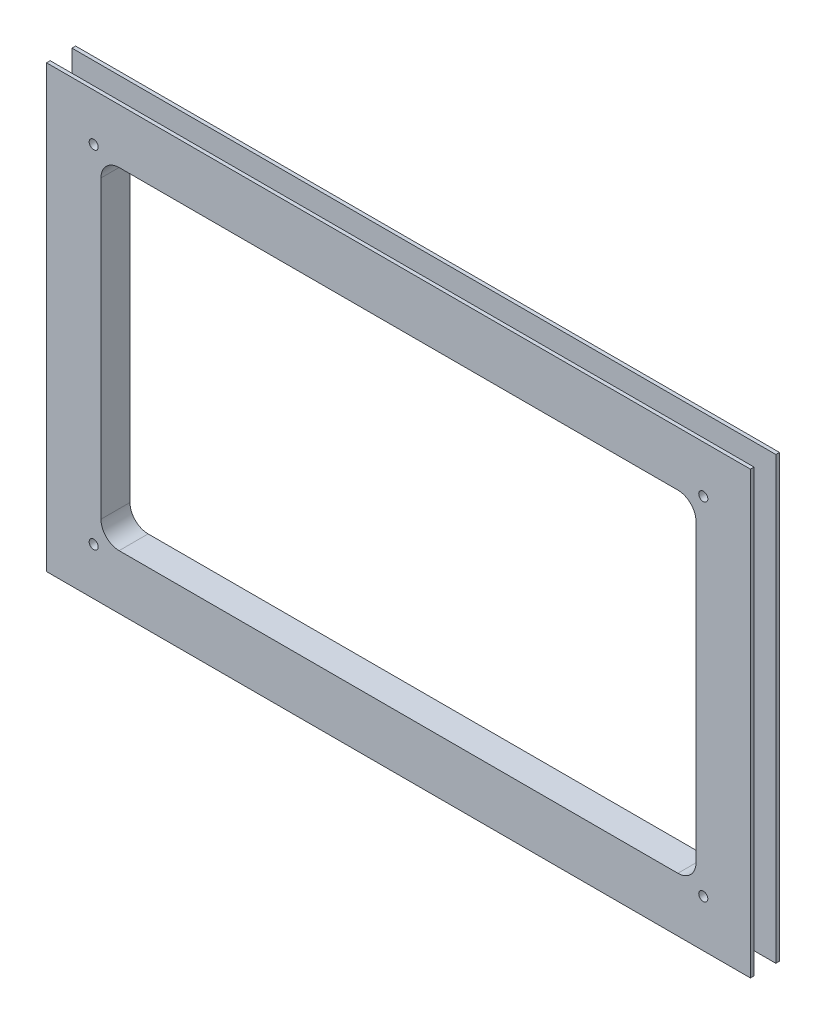
ISO-10303-21;
HEADER;
FILE_DESCRIPTION(('STEP AP214'),'2;1');
FILE_NAME('part.step','',(''),(''),'','','');
FILE_SCHEMA(('AUTOMOTIVE_DESIGN { 1 0 10303 214 1 1 1 1 }'));
ENDSEC;
DATA;
#1=APPLICATION_CONTEXT('core data for automotive mechanical design processes');
#2=APPLICATION_PROTOCOL_DEFINITION('international standard','automotive_design',2000,#1);
#3=PRODUCT_CONTEXT('',#1,'mechanical');
#4=PRODUCT('Part','Part','',(#3));
#5=PRODUCT_RELATED_PRODUCT_CATEGORY('part','',(#4));
#6=PRODUCT_DEFINITION_FORMATION('','',#4);
#7=PRODUCT_DEFINITION_CONTEXT('part definition',#1,'design');
#8=PRODUCT_DEFINITION('design','',#6,#7);
#9=PRODUCT_DEFINITION_SHAPE('','',#8);
#10=(LENGTH_UNIT() NAMED_UNIT(*) SI_UNIT(.MILLI.,.METRE.));
#11=(NAMED_UNIT(*) PLANE_ANGLE_UNIT() SI_UNIT($,.RADIAN.));
#12=(NAMED_UNIT(*) SI_UNIT($,.STERADIAN.) SOLID_ANGLE_UNIT());
#13=UNCERTAINTY_MEASURE_WITH_UNIT(LENGTH_MEASURE(1.E-05),#10,'distance_accuracy_value','');
#14=(GEOMETRIC_REPRESENTATION_CONTEXT(3) GLOBAL_UNCERTAINTY_ASSIGNED_CONTEXT((#13)) GLOBAL_UNIT_ASSIGNED_CONTEXT((#10,
#11,#12)) REPRESENTATION_CONTEXT('',''));
#15=CARTESIAN_POINT('',(0.,0.,0.));
#16=DIRECTION('',(0.,0.,1.));
#17=DIRECTION('',(1.,0.,0.));
#18=AXIS2_PLACEMENT_3D('',#15,#16,#17);
#19=CARTESIAN_POINT('',(0.,0.,-6.));
#20=DIRECTION('',(0.,0.,1.));
#21=DIRECTION('',(1.,0.,0.));
#22=AXIS2_PLACEMENT_3D('',#19,#20,#21);
#23=PLANE('',#22);
#24=DIRECTION('',(0.,1.,0.));
#25=VECTOR('',#24,1.);
#26=CARTESIAN_POINT('',(-194.,-121.45,-6.));
#27=LINE('',#26,#25);
#28=CARTESIAN_POINT('',(-194.,121.45,-6.));
#29=VERTEX_POINT('',#28);
#30=CARTESIAN_POINT('',(-194.,-121.45,-6.));
#31=VERTEX_POINT('',#30);
#32=EDGE_CURVE('E273',#29,#31,#27,.F.);
#33=ORIENTED_EDGE('',*,*,#32,.T.);
#34=DIRECTION('',(1.,0.,0.));
#35=VECTOR('',#34,1.);
#36=CARTESIAN_POINT('',(-194.,-121.45,-6.));
#37=LINE('',#36,#35);
#38=CARTESIAN_POINT('',(194.,-121.45,-6.));
#39=VERTEX_POINT('',#38);
#40=EDGE_CURVE('E267',#31,#39,#37,.T.);
#41=ORIENTED_EDGE('',*,*,#40,.T.);
#42=DIRECTION('',(0.,1.,0.));
#43=VECTOR('',#42,1.);
#44=CARTESIAN_POINT('',(194.,-121.45,-6.));
#45=LINE('',#44,#43);
#46=CARTESIAN_POINT('',(194.,121.45,-6.));
#47=VERTEX_POINT('',#46);
#48=EDGE_CURVE('E261',#39,#47,#45,.T.);
#49=ORIENTED_EDGE('',*,*,#48,.T.);
#50=DIRECTION('',(1.,0.,0.));
#51=VECTOR('',#50,1.);
#52=CARTESIAN_POINT('',(-194.,121.45,-6.));
#53=LINE('',#52,#51);
#54=EDGE_CURVE('E242',#47,#29,#53,.F.);
#55=ORIENTED_EDGE('',*,*,#54,.T.);
#56=EDGE_LOOP('',(#33,#41,#49,#55));
#57=FACE_BOUND('',#56,.T.);
#58=DIRECTION('',(0.,1.,0.));
#59=VECTOR('',#58,1.);
#60=CARTESIAN_POINT('',(-181.,-108.45,-6.));
#61=LINE('',#60,#59);
#62=CARTESIAN_POINT('',(-181.,98.45,-6.));
#63=VERTEX_POINT('',#62);
#64=CARTESIAN_POINT('',(-181.,-98.45,-6.));
#65=VERTEX_POINT('',#64);
#66=EDGE_CURVE('E163',#63,#65,#61,.F.);
#67=ORIENTED_EDGE('',*,*,#66,.F.);
#68=CARTESIAN_POINT('',(-171.,98.45,-6.));
#69=DIRECTION('',(0.,0.,1.));
#70=DIRECTION('',(1.,0.,0.));
#71=AXIS2_PLACEMENT_3D('',#68,#69,#70);
#72=CIRCLE('',#71,10.);
#73=CARTESIAN_POINT('',(-171.,108.45,-6.));
#74=VERTEX_POINT('',#73);
#75=EDGE_CURVE('E243',#74,#63,#72,.T.);
#76=ORIENTED_EDGE('',*,*,#75,.F.);
#77=DIRECTION('',(1.,0.,0.));
#78=VECTOR('',#77,1.);
#79=CARTESIAN_POINT('',(181.,108.45,-6.));
#80=LINE('',#79,#78);
#81=CARTESIAN_POINT('',(171.,108.45,-6.));
#82=VERTEX_POINT('',#81);
#83=EDGE_CURVE('E148',#82,#74,#80,.F.);
#84=ORIENTED_EDGE('',*,*,#83,.F.);
#85=CARTESIAN_POINT('',(171.,98.45,-6.));
#86=DIRECTION('',(0.,0.,1.));
#87=DIRECTION('',(1.,0.,0.));
#88=AXIS2_PLACEMENT_3D('',#85,#86,#87);
#89=CIRCLE('',#88,10.);
#90=CARTESIAN_POINT('',(181.,98.45,-6.));
#91=VERTEX_POINT('',#90);
#92=EDGE_CURVE('E19',#91,#82,#89,.T.);
#93=ORIENTED_EDGE('',*,*,#92,.F.);
#94=DIRECTION('',(0.,1.,0.));
#95=VECTOR('',#94,1.);
#96=CARTESIAN_POINT('',(181.,-108.45,-6.));
#97=LINE('',#96,#95);
#98=CARTESIAN_POINT('',(181.,-98.45,-6.));
#99=VERTEX_POINT('',#98);
#100=EDGE_CURVE('E133',#99,#91,#97,.T.);
#101=ORIENTED_EDGE('',*,*,#100,.F.);
#102=CARTESIAN_POINT('',(171.,-98.45,-6.));
#103=DIRECTION('',(0.,0.,1.));
#104=DIRECTION('',(1.,0.,0.));
#105=AXIS2_PLACEMENT_3D('',#102,#103,#104);
#106=CIRCLE('',#105,10.);
#107=CARTESIAN_POINT('',(171.,-108.45,-6.));
#108=VERTEX_POINT('',#107);
#109=EDGE_CURVE('E155',#108,#99,#106,.T.);
#110=ORIENTED_EDGE('',*,*,#109,.F.);
#111=DIRECTION('',(1.,0.,0.));
#112=VECTOR('',#111,1.);
#113=CARTESIAN_POINT('',(181.,-108.45,-6.));
#114=LINE('',#113,#112);
#115=CARTESIAN_POINT('',(-171.,-108.45,-6.));
#116=VERTEX_POINT('',#115);
#117=EDGE_CURVE('E167',#116,#108,#114,.T.);
#118=ORIENTED_EDGE('',*,*,#117,.F.);
#119=CARTESIAN_POINT('',(-171.,-98.45,-6.));
#120=DIRECTION('',(0.,0.,1.));
#121=DIRECTION('',(1.,0.,0.));
#122=AXIS2_PLACEMENT_3D('',#119,#120,#121);
#123=CIRCLE('',#122,10.);
#124=EDGE_CURVE('E246',#65,#116,#123,.T.);
#125=ORIENTED_EDGE('',*,*,#124,.F.);
#126=EDGE_LOOP('',(#67,#76,#84,#93,#101,#110,#118,#125));
#127=FACE_BOUND('',#126,.T.);
#128=ADVANCED_FACE('F16',(#57,#127),#23,.T.);
#129=CARTESIAN_POINT('',(171.,98.45,-6.));
#130=DIRECTION('',(0.,0.,1.));
#131=DIRECTION('',(1.,0.,0.));
#132=AXIS2_PLACEMENT_3D('',#129,#130,#131);
#133=CYLINDRICAL_SURFACE('',#132,10.);
#134=CARTESIAN_POINT('',(171.,98.45,6.));
#135=DIRECTION('',(0.,0.,1.));
#136=DIRECTION('',(1.,0.,0.));
#137=AXIS2_PLACEMENT_3D('',#134,#135,#136);
#138=CIRCLE('',#137,10.);
#139=CARTESIAN_POINT('',(171.,108.45,6.));
#140=VERTEX_POINT('',#139);
#141=CARTESIAN_POINT('',(181.,98.45,6.));
#142=VERTEX_POINT('',#141);
#143=EDGE_CURVE('E154',#140,#142,#138,.F.);
#144=ORIENTED_EDGE('',*,*,#143,.T.);
#145=DIRECTION('',(0.,0.,-1.));
#146=VECTOR('',#145,1.);
#147=CARTESIAN_POINT('',(181.,98.45,-6.));
#148=LINE('',#147,#146);
#149=EDGE_CURVE('E138',#91,#142,#148,.F.);
#150=ORIENTED_EDGE('',*,*,#149,.F.);
#151=ORIENTED_EDGE('',*,*,#92,.T.);
#152=DIRECTION('',(0.,0.,1.));
#153=VECTOR('',#152,1.);
#154=CARTESIAN_POINT('',(171.,108.45,-6.));
#155=LINE('',#154,#153);
#156=EDGE_CURVE('E162',#140,#82,#155,.F.);
#157=ORIENTED_EDGE('',*,*,#156,.F.);
#158=EDGE_LOOP('',(#144,#150,#151,#157));
#159=FACE_BOUND('',#158,.T.);
#160=ADVANCED_FACE('F153',(#159),#133,.T.);
#161=CARTESIAN_POINT('',(181.,-108.45,-6.));
#162=DIRECTION('',(1.,0.,0.));
#163=DIRECTION('',(0.,0.,-1.));
#164=AXIS2_PLACEMENT_3D('',#161,#162,#163);
#165=PLANE('',#164);
#166=ORIENTED_EDGE('',*,*,#100,.T.);
#167=ORIENTED_EDGE('',*,*,#149,.T.);
#168=DIRECTION('',(0.,1.,0.));
#169=VECTOR('',#168,1.);
#170=CARTESIAN_POINT('',(181.,0.,6.));
#171=LINE('',#170,#169);
#172=CARTESIAN_POINT('',(181.,-98.45,6.));
#173=VERTEX_POINT('',#172);
#174=EDGE_CURVE('E240',#142,#173,#171,.F.);
#175=ORIENTED_EDGE('',*,*,#174,.T.);
#176=DIRECTION('',(0.,0.,1.));
#177=VECTOR('',#176,1.);
#178=CARTESIAN_POINT('',(181.,-98.45,-6.));
#179=LINE('',#178,#177);
#180=EDGE_CURVE('E140',#99,#173,#179,.T.);
#181=ORIENTED_EDGE('',*,*,#180,.F.);
#182=EDGE_LOOP('',(#166,#167,#175,#181));
#183=FACE_BOUND('',#182,.T.);
#184=ADVANCED_FACE('F135',(#183),#165,.T.);
#185=CARTESIAN_POINT('',(171.,-98.45,-6.));
#186=DIRECTION('',(0.,0.,1.));
#187=DIRECTION('',(1.,0.,0.));
#188=AXIS2_PLACEMENT_3D('',#185,#186,#187);
#189=CYLINDRICAL_SURFACE('',#188,10.);
#190=CARTESIAN_POINT('',(171.,-98.45,6.));
#191=DIRECTION('',(0.,0.,1.));
#192=DIRECTION('',(1.,0.,0.));
#193=AXIS2_PLACEMENT_3D('',#190,#191,#192);
#194=CIRCLE('',#193,10.);
#195=CARTESIAN_POINT('',(171.,-108.45,6.));
#196=VERTEX_POINT('',#195);
#197=EDGE_CURVE('E237',#173,#196,#194,.F.);
#198=ORIENTED_EDGE('',*,*,#197,.T.);
#199=DIRECTION('',(0.,0.,-1.));
#200=VECTOR('',#199,1.);
#201=CARTESIAN_POINT('',(171.,-108.45,-6.));
#202=LINE('',#201,#200);
#203=EDGE_CURVE('E168',#108,#196,#202,.F.);
#204=ORIENTED_EDGE('',*,*,#203,.F.);
#205=ORIENTED_EDGE('',*,*,#109,.T.);
#206=ORIENTED_EDGE('',*,*,#180,.T.);
#207=EDGE_LOOP('',(#198,#204,#205,#206));
#208=FACE_BOUND('',#207,.T.);
#209=ADVANCED_FACE('F513',(#208),#189,.T.);
#210=CARTESIAN_POINT('',(181.,-108.45,-6.));
#211=DIRECTION('',(0.,-1.,0.));
#212=DIRECTION('',(0.,0.,-1.));
#213=AXIS2_PLACEMENT_3D('',#210,#211,#212);
#214=PLANE('',#213);
#215=DIRECTION('',(1.,0.,0.));
#216=VECTOR('',#215,1.);
#217=CARTESIAN_POINT('',(0.,-108.45,6.));
#218=LINE('',#217,#216);
#219=CARTESIAN_POINT('',(-171.,-108.45,6.));
#220=VERTEX_POINT('',#219);
#221=EDGE_CURVE('E236',#196,#220,#218,.F.);
#222=ORIENTED_EDGE('',*,*,#221,.T.);
#223=DIRECTION('',(0.,0.,1.));
#224=VECTOR('',#223,1.);
#225=CARTESIAN_POINT('',(-171.,-108.45,-6.));
#226=LINE('',#225,#224);
#227=EDGE_CURVE('E166',#116,#220,#226,.T.);
#228=ORIENTED_EDGE('',*,*,#227,.F.);
#229=ORIENTED_EDGE('',*,*,#117,.T.);
#230=ORIENTED_EDGE('',*,*,#203,.T.);
#231=EDGE_LOOP('',(#222,#228,#229,#230));
#232=FACE_BOUND('',#231,.T.);
#233=ADVANCED_FACE('F518',(#232),#214,.T.);
#234=CARTESIAN_POINT('',(-171.,-98.45,-6.));
#235=DIRECTION('',(0.,0.,1.));
#236=DIRECTION('',(1.,0.,0.));
#237=AXIS2_PLACEMENT_3D('',#234,#235,#236);
#238=CYLINDRICAL_SURFACE('',#237,10.);
#239=CARTESIAN_POINT('',(-171.,-98.45,6.));
#240=DIRECTION('',(0.,0.,1.));
#241=DIRECTION('',(1.,0.,0.));
#242=AXIS2_PLACEMENT_3D('',#239,#240,#241);
#243=CIRCLE('',#242,10.);
#244=CARTESIAN_POINT('',(-181.,-98.45,6.));
#245=VERTEX_POINT('',#244);
#246=EDGE_CURVE('E233',#220,#245,#243,.F.);
#247=ORIENTED_EDGE('',*,*,#246,.T.);
#248=DIRECTION('',(0.,0.,1.));
#249=VECTOR('',#248,1.);
#250=CARTESIAN_POINT('',(-181.,-98.45,-6.));
#251=LINE('',#250,#249);
#252=EDGE_CURVE('E165',#65,#245,#251,.T.);
#253=ORIENTED_EDGE('',*,*,#252,.F.);
#254=ORIENTED_EDGE('',*,*,#124,.T.);
#255=ORIENTED_EDGE('',*,*,#227,.T.);
#256=EDGE_LOOP('',(#247,#253,#254,#255));
#257=FACE_BOUND('',#256,.T.);
#258=ADVANCED_FACE('F522',(#257),#238,.T.);
#259=CARTESIAN_POINT('',(-181.,-108.45,-6.));
#260=DIRECTION('',(-1.,0.,0.));
#261=DIRECTION('',(0.,0.,1.));
#262=AXIS2_PLACEMENT_3D('',#259,#260,#261);
#263=PLANE('',#262);
#264=DIRECTION('',(0.,1.,0.));
#265=VECTOR('',#264,1.);
#266=CARTESIAN_POINT('',(-181.,0.,6.));
#267=LINE('',#266,#265);
#268=CARTESIAN_POINT('',(-181.,98.45,6.));
#269=VERTEX_POINT('',#268);
#270=EDGE_CURVE('E232',#245,#269,#267,.T.);
#271=ORIENTED_EDGE('',*,*,#270,.T.);
#272=DIRECTION('',(0.,0.,1.));
#273=VECTOR('',#272,1.);
#274=CARTESIAN_POINT('',(-181.,98.45,-6.));
#275=LINE('',#274,#273);
#276=EDGE_CURVE('E245',#63,#269,#275,.T.);
#277=ORIENTED_EDGE('',*,*,#276,.F.);
#278=ORIENTED_EDGE('',*,*,#66,.T.);
#279=ORIENTED_EDGE('',*,*,#252,.T.);
#280=EDGE_LOOP('',(#271,#277,#278,#279));
#281=FACE_BOUND('',#280,.T.);
#282=ADVANCED_FACE('F525',(#281),#263,.T.);
#283=CARTESIAN_POINT('',(-171.,98.45,-6.));
#284=DIRECTION('',(0.,0.,1.));
#285=DIRECTION('',(1.,0.,0.));
#286=AXIS2_PLACEMENT_3D('',#283,#284,#285);
#287=CYLINDRICAL_SURFACE('',#286,10.);
#288=CARTESIAN_POINT('',(-171.,98.45,6.));
#289=DIRECTION('',(0.,0.,1.));
#290=DIRECTION('',(1.,0.,0.));
#291=AXIS2_PLACEMENT_3D('',#288,#289,#290);
#292=CIRCLE('',#291,10.);
#293=CARTESIAN_POINT('',(-171.,108.45,6.));
#294=VERTEX_POINT('',#293);
#295=EDGE_CURVE('E228',#269,#294,#292,.F.);
#296=ORIENTED_EDGE('',*,*,#295,.T.);
#297=DIRECTION('',(0.,0.,1.));
#298=VECTOR('',#297,1.);
#299=CARTESIAN_POINT('',(-171.,108.45,-6.));
#300=LINE('',#299,#298);
#301=EDGE_CURVE('E161',#74,#294,#300,.T.);
#302=ORIENTED_EDGE('',*,*,#301,.F.);
#303=ORIENTED_EDGE('',*,*,#75,.T.);
#304=ORIENTED_EDGE('',*,*,#276,.T.);
#305=EDGE_LOOP('',(#296,#302,#303,#304));
#306=FACE_BOUND('',#305,.T.);
#307=ADVANCED_FACE('F528',(#306),#287,.T.);
#308=CARTESIAN_POINT('',(181.,108.45,-6.));
#309=DIRECTION('',(0.,1.,0.));
#310=DIRECTION('',(0.,0.,1.));
#311=AXIS2_PLACEMENT_3D('',#308,#309,#310);
#312=PLANE('',#311);
#313=ORIENTED_EDGE('',*,*,#83,.T.);
#314=ORIENTED_EDGE('',*,*,#301,.T.);
#315=DIRECTION('',(1.,0.,0.));
#316=VECTOR('',#315,1.);
#317=CARTESIAN_POINT('',(0.,108.45,6.));
#318=LINE('',#317,#316);
#319=EDGE_CURVE('E231',#294,#140,#318,.T.);
#320=ORIENTED_EDGE('',*,*,#319,.T.);
#321=ORIENTED_EDGE('',*,*,#156,.T.);
#322=EDGE_LOOP('',(#313,#314,#320,#321));
#323=FACE_BOUND('',#322,.T.);
#324=ADVANCED_FACE('F532',(#323),#312,.T.);
#325=CARTESIAN_POINT('',(194.,-121.45,8.));
#326=DIRECTION('',(-1.,0.,0.));
#327=DIRECTION('',(0.,0.,1.));
#328=AXIS2_PLACEMENT_3D('',#325,#326,#327);
#329=PLANE('',#328);
#330=DIRECTION('',(0.,0.,1.));
#331=VECTOR('',#330,1.);
#332=CARTESIAN_POINT('',(194.,-121.45,8.));
#333=LINE('',#332,#331);
#334=CARTESIAN_POINT('',(194.,-121.45,-8.));
#335=VERTEX_POINT('',#334);
#336=EDGE_CURVE('E264',#39,#335,#333,.F.);
#337=ORIENTED_EDGE('',*,*,#336,.T.);
#338=DIRECTION('',(0.,1.,0.));
#339=VECTOR('',#338,1.);
#340=CARTESIAN_POINT('',(194.,0.,-8.));
#341=LINE('',#340,#339);
#342=CARTESIAN_POINT('',(194.,121.45,-8.));
#343=VERTEX_POINT('',#342);
#344=EDGE_CURVE('E290',#343,#335,#341,.F.);
#345=ORIENTED_EDGE('',*,*,#344,.F.);
#346=DIRECTION('',(0.,0.,-1.));
#347=VECTOR('',#346,1.);
#348=CARTESIAN_POINT('',(194.,121.45,8.));
#349=LINE('',#348,#347);
#350=EDGE_CURVE('E279',#343,#47,#349,.F.);
#351=ORIENTED_EDGE('',*,*,#350,.T.);
#352=ORIENTED_EDGE('',*,*,#48,.F.);
#353=EDGE_LOOP('',(#337,#345,#351,#352));
#354=FACE_BOUND('',#353,.T.);
#355=ADVANCED_FACE('F494',(#354),#329,.F.);
#356=CARTESIAN_POINT('',(-194.,-121.45,8.));
#357=DIRECTION('',(0.,1.,0.));
#358=DIRECTION('',(0.,0.,1.));
#359=AXIS2_PLACEMENT_3D('',#356,#357,#358);
#360=PLANE('',#359);
#361=DIRECTION('',(0.,0.,-1.));
#362=VECTOR('',#361,1.);
#363=CARTESIAN_POINT('',(-194.,-121.45,8.));
#364=LINE('',#363,#362);
#365=CARTESIAN_POINT('',(-194.,-121.45,-8.));
#366=VERTEX_POINT('',#365);
#367=EDGE_CURVE('E270',#31,#366,#364,.T.);
#368=ORIENTED_EDGE('',*,*,#367,.T.);
#369=DIRECTION('',(-1.,0.,0.));
#370=VECTOR('',#369,1.);
#371=CARTESIAN_POINT('',(0.,-121.45,-8.));
#372=LINE('',#371,#370);
#373=EDGE_CURVE('E299',#335,#366,#372,.T.);
#374=ORIENTED_EDGE('',*,*,#373,.F.);
#375=ORIENTED_EDGE('',*,*,#336,.F.);
#376=ORIENTED_EDGE('',*,*,#40,.F.);
#377=EDGE_LOOP('',(#368,#374,#375,#376));
#378=FACE_BOUND('',#377,.T.);
#379=ADVANCED_FACE('F504',(#378),#360,.F.);
#380=CARTESIAN_POINT('',(-194.,-121.45,8.));
#381=DIRECTION('',(1.,0.,0.));
#382=DIRECTION('',(0.,0.,-1.));
#383=AXIS2_PLACEMENT_3D('',#380,#381,#382);
#384=PLANE('',#383);
#385=DIRECTION('',(0.,0.,-1.));
#386=VECTOR('',#385,1.);
#387=CARTESIAN_POINT('',(-194.,121.45,8.));
#388=LINE('',#387,#386);
#389=CARTESIAN_POINT('',(-194.,121.45,-8.));
#390=VERTEX_POINT('',#389);
#391=EDGE_CURVE('E276',#29,#390,#388,.T.);
#392=ORIENTED_EDGE('',*,*,#391,.T.);
#393=DIRECTION('',(0.,1.,0.));
#394=VECTOR('',#393,1.);
#395=CARTESIAN_POINT('',(-194.,0.,-8.));
#396=LINE('',#395,#394);
#397=EDGE_CURVE('E302',#366,#390,#396,.T.);
#398=ORIENTED_EDGE('',*,*,#397,.F.);
#399=ORIENTED_EDGE('',*,*,#367,.F.);
#400=ORIENTED_EDGE('',*,*,#32,.F.);
#401=EDGE_LOOP('',(#392,#398,#399,#400));
#402=FACE_BOUND('',#401,.T.);
#403=ADVANCED_FACE('F485',(#402),#384,.F.);
#404=CARTESIAN_POINT('',(-194.,121.45,8.));
#405=DIRECTION('',(0.,-1.,0.));
#406=DIRECTION('',(0.,0.,-1.));
#407=AXIS2_PLACEMENT_3D('',#404,#405,#406);
#408=PLANE('',#407);
#409=ORIENTED_EDGE('',*,*,#350,.F.);
#410=DIRECTION('',(-1.,0.,0.));
#411=VECTOR('',#410,1.);
#412=CARTESIAN_POINT('',(0.,121.45,-8.));
#413=LINE('',#412,#411);
#414=EDGE_CURVE('E227',#390,#343,#413,.F.);
#415=ORIENTED_EDGE('',*,*,#414,.F.);
#416=ORIENTED_EDGE('',*,*,#391,.F.);
#417=ORIENTED_EDGE('',*,*,#54,.F.);
#418=EDGE_LOOP('',(#409,#415,#416,#417));
#419=FACE_BOUND('',#418,.T.);
#420=ADVANCED_FACE('F408',(#419),#408,.F.);
#421=CARTESIAN_POINT('',(0.,0.,6.));
#422=DIRECTION('',(0.,0.,1.));
#423=DIRECTION('',(1.,0.,0.));
#424=AXIS2_PLACEMENT_3D('',#421,#422,#423);
#425=PLANE('',#424);
#426=DIRECTION('',(0.,1.,0.));
#427=VECTOR('',#426,1.);
#428=CARTESIAN_POINT('',(-194.,-121.45,6.));
#429=LINE('',#428,#427);
#430=CARTESIAN_POINT('',(-194.,-121.45,6.));
#431=VERTEX_POINT('',#430);
#432=CARTESIAN_POINT('',(-194.,121.45,6.));
#433=VERTEX_POINT('',#432);
#434=EDGE_CURVE('E315',#431,#433,#429,.T.);
#435=ORIENTED_EDGE('',*,*,#434,.T.);
#436=DIRECTION('',(1.,0.,0.));
#437=VECTOR('',#436,1.);
#438=CARTESIAN_POINT('',(-194.,121.45,6.));
#439=LINE('',#438,#437);
#440=CARTESIAN_POINT('',(194.,121.45,6.));
#441=VERTEX_POINT('',#440);
#442=EDGE_CURVE('E321',#433,#441,#439,.T.);
#443=ORIENTED_EDGE('',*,*,#442,.T.);
#444=DIRECTION('',(0.,1.,0.));
#445=VECTOR('',#444,1.);
#446=CARTESIAN_POINT('',(194.,-121.45,6.));
#447=LINE('',#446,#445);
#448=CARTESIAN_POINT('',(194.,-121.45,6.));
#449=VERTEX_POINT('',#448);
#450=EDGE_CURVE('E327',#441,#449,#447,.F.);
#451=ORIENTED_EDGE('',*,*,#450,.T.);
#452=DIRECTION('',(1.,0.,0.));
#453=VECTOR('',#452,1.);
#454=CARTESIAN_POINT('',(-194.,-121.45,6.));
#455=LINE('',#454,#453);
#456=EDGE_CURVE('E217',#449,#431,#455,.F.);
#457=ORIENTED_EDGE('',*,*,#456,.T.);
#458=EDGE_LOOP('',(#435,#443,#451,#457));
#459=FACE_BOUND('',#458,.T.);
#460=ORIENTED_EDGE('',*,*,#295,.F.);
#461=ORIENTED_EDGE('',*,*,#270,.F.);
#462=ORIENTED_EDGE('',*,*,#246,.F.);
#463=ORIENTED_EDGE('',*,*,#221,.F.);
#464=ORIENTED_EDGE('',*,*,#197,.F.);
#465=ORIENTED_EDGE('',*,*,#174,.F.);
#466=ORIENTED_EDGE('',*,*,#143,.F.);
#467=ORIENTED_EDGE('',*,*,#319,.F.);
#468=EDGE_LOOP('',(#460,#461,#462,#463,#464,#465,#466,#467));
#469=FACE_BOUND('',#468,.T.);
#470=ADVANCED_FACE('F397',(#459,#469),#425,.F.);
#471=CARTESIAN_POINT('',(0.,0.,-8.));
#472=DIRECTION('',(0.,0.,-1.));
#473=DIRECTION('',(-1.,0.,0.));
#474=AXIS2_PLACEMENT_3D('',#471,#472,#473);
#475=PLANE('',#474);
#476=CARTESIAN_POINT('',(-168.,95.45,-8.00000000000001));
#477=DIRECTION('',(0.,0.,1.));
#478=DIRECTION('',(1.,0.,0.));
#479=AXIS2_PLACEMENT_3D('',#476,#477,#478);
#480=CIRCLE('',#479,2.5);
#481=CARTESIAN_POINT('',(-165.5,95.45,-8.00000000000001));
#482=VERTEX_POINT('',#481);
#483=EDGE_CURVE('E224',#482,#482,#480,.T.);
#484=ORIENTED_EDGE('',*,*,#483,.T.);
#485=EDGE_LOOP('',(#484));
#486=FACE_BOUND('',#485,.T.);
#487=CARTESIAN_POINT('',(-168.,-95.45,-8.00000000000001));
#488=DIRECTION('',(0.,0.,1.));
#489=DIRECTION('',(1.,0.,0.));
#490=AXIS2_PLACEMENT_3D('',#487,#488,#489);
#491=CIRCLE('',#490,2.5);
#492=CARTESIAN_POINT('',(-165.5,-95.45,-8.00000000000001));
#493=VERTEX_POINT('',#492);
#494=EDGE_CURVE('E221',#493,#493,#491,.T.);
#495=ORIENTED_EDGE('',*,*,#494,.T.);
#496=EDGE_LOOP('',(#495));
#497=FACE_BOUND('',#496,.T.);
#498=CARTESIAN_POINT('',(168.,-95.45,-8.00000000000001));
#499=DIRECTION('',(0.,0.,1.));
#500=DIRECTION('',(1.,0.,0.));
#501=AXIS2_PLACEMENT_3D('',#498,#499,#500);
#502=CIRCLE('',#501,2.5);
#503=CARTESIAN_POINT('',(170.5,-95.45,-8.00000000000001));
#504=VERTEX_POINT('',#503);
#505=EDGE_CURVE('E218',#504,#504,#502,.T.);
#506=ORIENTED_EDGE('',*,*,#505,.T.);
#507=EDGE_LOOP('',(#506));
#508=FACE_BOUND('',#507,.T.);
#509=CARTESIAN_POINT('',(168.,95.45,-8.00000000000001));
#510=DIRECTION('',(0.,0.,1.));
#511=DIRECTION('',(1.,0.,0.));
#512=AXIS2_PLACEMENT_3D('',#509,#510,#511);
#513=CIRCLE('',#512,2.5);
#514=CARTESIAN_POINT('',(170.5,95.45,-8.00000000000001));
#515=VERTEX_POINT('',#514);
#516=EDGE_CURVE('E214',#515,#515,#513,.T.);
#517=ORIENTED_EDGE('',*,*,#516,.T.);
#518=EDGE_LOOP('',(#517));
#519=FACE_BOUND('',#518,.T.);
#520=ORIENTED_EDGE('',*,*,#397,.T.);
#521=ORIENTED_EDGE('',*,*,#414,.T.);
#522=ORIENTED_EDGE('',*,*,#344,.T.);
#523=ORIENTED_EDGE('',*,*,#373,.T.);
#524=EDGE_LOOP('',(#520,#521,#522,#523));
#525=FACE_BOUND('',#524,.T.);
#526=DIRECTION('',(1.,0.,0.));
#527=VECTOR('',#526,1.);
#528=CARTESIAN_POINT('',(164.,91.45,-8.00000000000001));
#529=LINE('',#528,#527);
#530=CARTESIAN_POINT('',(154.,91.45,-8.00000000000001));
#531=VERTEX_POINT('',#530);
#532=CARTESIAN_POINT('',(-154.,91.45,-8.00000000000001));
#533=VERTEX_POINT('',#532);
#534=EDGE_CURVE('E291',#531,#533,#529,.F.);
#535=ORIENTED_EDGE('',*,*,#534,.T.);
#536=CARTESIAN_POINT('',(-154.,81.45,-8.00000000000001));
#537=DIRECTION('',(0.,0.,-1.));
#538=DIRECTION('',(-1.,0.,0.));
#539=AXIS2_PLACEMENT_3D('',#536,#537,#538);
#540=CIRCLE('',#539,10.);
#541=CARTESIAN_POINT('',(-164.,81.45,-8.00000000000001));
#542=VERTEX_POINT('',#541);
#543=EDGE_CURVE('E206',#533,#542,#540,.F.);
#544=ORIENTED_EDGE('',*,*,#543,.T.);
#545=DIRECTION('',(0.,1.,0.));
#546=VECTOR('',#545,1.);
#547=CARTESIAN_POINT('',(-164.,91.45,-8.00000000000001));
#548=LINE('',#547,#546);
#549=CARTESIAN_POINT('',(-164.,-81.45,-8.00000000000001));
#550=VERTEX_POINT('',#549);
#551=EDGE_CURVE('E293',#542,#550,#548,.F.);
#552=ORIENTED_EDGE('',*,*,#551,.T.);
#553=CARTESIAN_POINT('',(-154.,-81.45,-8.00000000000001));
#554=DIRECTION('',(0.,0.,-1.));
#555=DIRECTION('',(-1.,0.,0.));
#556=AXIS2_PLACEMENT_3D('',#553,#554,#555);
#557=CIRCLE('',#556,10.);
#558=CARTESIAN_POINT('',(-154.,-91.45,-8.00000000000001));
#559=VERTEX_POINT('',#558);
#560=EDGE_CURVE('E202',#550,#559,#557,.F.);
#561=ORIENTED_EDGE('',*,*,#560,.T.);
#562=DIRECTION('',(1.,0.,0.));
#563=VECTOR('',#562,1.);
#564=CARTESIAN_POINT('',(-164.,-91.45,-8.00000000000001));
#565=LINE('',#564,#563);
#566=CARTESIAN_POINT('',(154.,-91.45,-8.00000000000001));
#567=VERTEX_POINT('',#566);
#568=EDGE_CURVE('E295',#559,#567,#565,.T.);
#569=ORIENTED_EDGE('',*,*,#568,.T.);
#570=CARTESIAN_POINT('',(154.,-81.45,-8.00000000000001));
#571=DIRECTION('',(0.,0.,-1.));
#572=DIRECTION('',(-1.,0.,0.));
#573=AXIS2_PLACEMENT_3D('',#570,#571,#572);
#574=CIRCLE('',#573,10.);
#575=CARTESIAN_POINT('',(164.,-81.45,-8.00000000000001));
#576=VERTEX_POINT('',#575);
#577=EDGE_CURVE('E199',#567,#576,#574,.F.);
#578=ORIENTED_EDGE('',*,*,#577,.T.);
#579=DIRECTION('',(0.,1.,0.));
#580=VECTOR('',#579,1.);
#581=CARTESIAN_POINT('',(164.,-91.45,-8.00000000000001));
#582=LINE('',#581,#580);
#583=CARTESIAN_POINT('',(164.,81.45,-8.00000000000001));
#584=VERTEX_POINT('',#583);
#585=EDGE_CURVE('E307',#576,#584,#582,.T.);
#586=ORIENTED_EDGE('',*,*,#585,.T.);
#587=CARTESIAN_POINT('',(154.,81.45,-8.00000000000001));
#588=DIRECTION('',(0.,0.,-1.));
#589=DIRECTION('',(-1.,0.,0.));
#590=AXIS2_PLACEMENT_3D('',#587,#588,#589);
#591=CIRCLE('',#590,10.);
#592=EDGE_CURVE('E210',#584,#531,#591,.F.);
#593=ORIENTED_EDGE('',*,*,#592,.T.);
#594=EDGE_LOOP('',(#535,#544,#552,#561,#569,#578,#586,#593));
#595=FACE_BOUND('',#594,.T.);
#596=ADVANCED_FACE('F394',(#486,#497,#508,#519,#525,#595),#475,.T.);
#597=CARTESIAN_POINT('',(-168.,95.45,8.));
#598=DIRECTION('',(0.,0.,1.));
#599=DIRECTION('',(1.,0.,0.));
#600=AXIS2_PLACEMENT_3D('',#597,#598,#599);
#601=CYLINDRICAL_SURFACE('',#600,2.5);
#602=ORIENTED_EDGE('',*,*,#483,.F.);
#603=EDGE_LOOP('',(#602));
#604=FACE_BOUND('',#603,.T.);
#605=CARTESIAN_POINT('',(-168.,95.45,8.));
#606=DIRECTION('',(0.,0.,1.));
#607=DIRECTION('',(1.,0.,0.));
#608=AXIS2_PLACEMENT_3D('',#605,#606,#607);
#609=CIRCLE('',#608,2.5);
#610=CARTESIAN_POINT('',(-165.5,95.45,8.));
#611=VERTEX_POINT('',#610);
#612=EDGE_CURVE('E195',#611,#611,#609,.T.);
#613=ORIENTED_EDGE('',*,*,#612,.T.);
#614=EDGE_LOOP('',(#613));
#615=FACE_BOUND('',#614,.T.);
#616=ADVANCED_FACE('F396',(#604,#615),#601,.F.);
#617=CARTESIAN_POINT('',(-168.,-95.45,8.));
#618=DIRECTION('',(0.,0.,1.));
#619=DIRECTION('',(1.,0.,0.));
#620=AXIS2_PLACEMENT_3D('',#617,#618,#619);
#621=CYLINDRICAL_SURFACE('',#620,2.5);
#622=ORIENTED_EDGE('',*,*,#494,.F.);
#623=EDGE_LOOP('',(#622));
#624=FACE_BOUND('',#623,.T.);
#625=CARTESIAN_POINT('',(-168.,-95.45,8.));
#626=DIRECTION('',(0.,0.,1.));
#627=DIRECTION('',(1.,0.,0.));
#628=AXIS2_PLACEMENT_3D('',#625,#626,#627);
#629=CIRCLE('',#628,2.5);
#630=CARTESIAN_POINT('',(-165.5,-95.45,8.));
#631=VERTEX_POINT('',#630);
#632=EDGE_CURVE('E192',#631,#631,#629,.T.);
#633=ORIENTED_EDGE('',*,*,#632,.T.);
#634=EDGE_LOOP('',(#633));
#635=FACE_BOUND('',#634,.T.);
#636=ADVANCED_FACE('F405',(#624,#635),#621,.F.);
#637=CARTESIAN_POINT('',(168.,-95.45,8.));
#638=DIRECTION('',(0.,0.,1.));
#639=DIRECTION('',(1.,0.,0.));
#640=AXIS2_PLACEMENT_3D('',#637,#638,#639);
#641=CYLINDRICAL_SURFACE('',#640,2.5);
#642=ORIENTED_EDGE('',*,*,#505,.F.);
#643=EDGE_LOOP('',(#642));
#644=FACE_BOUND('',#643,.T.);
#645=CARTESIAN_POINT('',(168.,-95.45,8.));
#646=DIRECTION('',(0.,0.,1.));
#647=DIRECTION('',(1.,0.,0.));
#648=AXIS2_PLACEMENT_3D('',#645,#646,#647);
#649=CIRCLE('',#648,2.5);
#650=CARTESIAN_POINT('',(170.5,-95.45,8.));
#651=VERTEX_POINT('',#650);
#652=EDGE_CURVE('E189',#651,#651,#649,.T.);
#653=ORIENTED_EDGE('',*,*,#652,.T.);
#654=EDGE_LOOP('',(#653));
#655=FACE_BOUND('',#654,.T.);
#656=ADVANCED_FACE('F452',(#644,#655),#641,.F.);
#657=CARTESIAN_POINT('',(168.,95.45,8.));
#658=DIRECTION('',(0.,0.,1.));
#659=DIRECTION('',(1.,0.,0.));
#660=AXIS2_PLACEMENT_3D('',#657,#658,#659);
#661=CYLINDRICAL_SURFACE('',#660,2.5);
#662=ORIENTED_EDGE('',*,*,#516,.F.);
#663=EDGE_LOOP('',(#662));
#664=FACE_BOUND('',#663,.T.);
#665=CARTESIAN_POINT('',(168.,95.45,8.));
#666=DIRECTION('',(0.,0.,1.));
#667=DIRECTION('',(1.,0.,0.));
#668=AXIS2_PLACEMENT_3D('',#665,#666,#667);
#669=CIRCLE('',#668,2.5);
#670=CARTESIAN_POINT('',(170.5,95.45,8.));
#671=VERTEX_POINT('',#670);
#672=EDGE_CURVE('E185',#671,#671,#669,.T.);
#673=ORIENTED_EDGE('',*,*,#672,.T.);
#674=EDGE_LOOP('',(#673));
#675=FACE_BOUND('',#674,.T.);
#676=ADVANCED_FACE('F448',(#664,#675),#661,.F.);
#677=CARTESIAN_POINT('',(-194.,-121.45,8.));
#678=DIRECTION('',(0.,1.,0.));
#679=DIRECTION('',(0.,0.,1.));
#680=AXIS2_PLACEMENT_3D('',#677,#678,#679);
#681=PLANE('',#680);
#682=ORIENTED_EDGE('',*,*,#456,.F.);
#683=DIRECTION('',(0.,0.,1.));
#684=VECTOR('',#683,1.);
#685=CARTESIAN_POINT('',(194.,-121.45,8.));
#686=LINE('',#685,#684);
#687=CARTESIAN_POINT('',(194.,-121.45,8.));
#688=VERTEX_POINT('',#687);
#689=EDGE_CURVE('E213',#449,#688,#686,.T.);
#690=ORIENTED_EDGE('',*,*,#689,.T.);
#691=DIRECTION('',(-1.,0.,0.));
#692=VECTOR('',#691,1.);
#693=CARTESIAN_POINT('',(0.,-121.45,8.));
#694=LINE('',#693,#692);
#695=CARTESIAN_POINT('',(-194.,-121.45,8.));
#696=VERTEX_POINT('',#695);
#697=EDGE_CURVE('E188',#688,#696,#694,.T.);
#698=ORIENTED_EDGE('',*,*,#697,.T.);
#699=DIRECTION('',(0.,0.,-1.));
#700=VECTOR('',#699,1.);
#701=CARTESIAN_POINT('',(-194.,-121.45,8.));
#702=LINE('',#701,#700);
#703=EDGE_CURVE('E312',#696,#431,#702,.T.);
#704=ORIENTED_EDGE('',*,*,#703,.T.);
#705=EDGE_LOOP('',(#682,#690,#698,#704));
#706=FACE_BOUND('',#705,.T.);
#707=ADVANCED_FACE('F444',(#706),#681,.F.);
#708=CARTESIAN_POINT('',(-194.,-121.45,8.));
#709=DIRECTION('',(1.,0.,0.));
#710=DIRECTION('',(0.,0.,-1.));
#711=AXIS2_PLACEMENT_3D('',#708,#709,#710);
#712=PLANE('',#711);
#713=ORIENTED_EDGE('',*,*,#434,.F.);
#714=ORIENTED_EDGE('',*,*,#703,.F.);
#715=DIRECTION('',(0.,1.,0.));
#716=VECTOR('',#715,1.);
#717=CARTESIAN_POINT('',(-194.,0.,8.));
#718=LINE('',#717,#716);
#719=CARTESIAN_POINT('',(-194.,121.45,8.));
#720=VERTEX_POINT('',#719);
#721=EDGE_CURVE('E349',#696,#720,#718,.T.);
#722=ORIENTED_EDGE('',*,*,#721,.T.);
#723=DIRECTION('',(0.,0.,-1.));
#724=VECTOR('',#723,1.);
#725=CARTESIAN_POINT('',(-194.,121.45,8.));
#726=LINE('',#725,#724);
#727=EDGE_CURVE('E318',#720,#433,#726,.T.);
#728=ORIENTED_EDGE('',*,*,#727,.T.);
#729=EDGE_LOOP('',(#713,#714,#722,#728));
#730=FACE_BOUND('',#729,.T.);
#731=ADVANCED_FACE('F440',(#730),#712,.F.);
#732=CARTESIAN_POINT('',(-194.,121.45,8.));
#733=DIRECTION('',(0.,-1.,0.));
#734=DIRECTION('',(0.,0.,-1.));
#735=AXIS2_PLACEMENT_3D('',#732,#733,#734);
#736=PLANE('',#735);
#737=ORIENTED_EDGE('',*,*,#442,.F.);
#738=ORIENTED_EDGE('',*,*,#727,.F.);
#739=DIRECTION('',(-1.,0.,0.));
#740=VECTOR('',#739,1.);
#741=CARTESIAN_POINT('',(0.,121.45,8.));
#742=LINE('',#741,#740);
#743=CARTESIAN_POINT('',(194.,121.45,8.));
#744=VERTEX_POINT('',#743);
#745=EDGE_CURVE('E352',#720,#744,#742,.F.);
#746=ORIENTED_EDGE('',*,*,#745,.T.);
#747=DIRECTION('',(0.,0.,1.));
#748=VECTOR('',#747,1.);
#749=CARTESIAN_POINT('',(194.,121.45,8.));
#750=LINE('',#749,#748);
#751=EDGE_CURVE('E324',#744,#441,#750,.F.);
#752=ORIENTED_EDGE('',*,*,#751,.T.);
#753=EDGE_LOOP('',(#737,#738,#746,#752));
#754=FACE_BOUND('',#753,.T.);
#755=ADVANCED_FACE('F436',(#754),#736,.F.);
#756=CARTESIAN_POINT('',(194.,-121.45,8.));
#757=DIRECTION('',(-1.,0.,0.));
#758=DIRECTION('',(0.,0.,1.));
#759=AXIS2_PLACEMENT_3D('',#756,#757,#758);
#760=PLANE('',#759);
#761=ORIENTED_EDGE('',*,*,#450,.F.);
#762=ORIENTED_EDGE('',*,*,#751,.F.);
#763=DIRECTION('',(0.,1.,0.));
#764=VECTOR('',#763,1.);
#765=CARTESIAN_POINT('',(194.,0.,8.));
#766=LINE('',#765,#764);
#767=EDGE_CURVE('E184',#744,#688,#766,.F.);
#768=ORIENTED_EDGE('',*,*,#767,.T.);
#769=ORIENTED_EDGE('',*,*,#689,.F.);
#770=EDGE_LOOP('',(#761,#762,#768,#769));
#771=FACE_BOUND('',#770,.T.);
#772=ADVANCED_FACE('F433',(#771),#760,.F.);
#773=CARTESIAN_POINT('',(154.,81.45,-410.830497852385));
#774=DIRECTION('',(0.,0.,-1.));
#775=DIRECTION('',(-1.,0.,0.));
#776=AXIS2_PLACEMENT_3D('',#773,#774,#775);
#777=CYLINDRICAL_SURFACE('',#776,10.);
#778=DIRECTION('',(0.,0.,-1.));
#779=VECTOR('',#778,1.);
#780=CARTESIAN_POINT('',(164.,81.45,-410.830497852385));
#781=LINE('',#780,#779);
#782=CARTESIAN_POINT('',(164.,81.45,8.00000000000001));
#783=VERTEX_POINT('',#782);
#784=EDGE_CURVE('E198',#584,#783,#781,.F.);
#785=ORIENTED_EDGE('',*,*,#784,.T.);
#786=CARTESIAN_POINT('',(154.,81.45,8.00000000000001));
#787=DIRECTION('',(0.,0.,-1.));
#788=DIRECTION('',(-1.,0.,0.));
#789=AXIS2_PLACEMENT_3D('',#786,#787,#788);
#790=CIRCLE('',#789,10.);
#791=CARTESIAN_POINT('',(154.,91.45,8.00000000000001));
#792=VERTEX_POINT('',#791);
#793=EDGE_CURVE('E181',#783,#792,#790,.F.);
#794=ORIENTED_EDGE('',*,*,#793,.T.);
#795=DIRECTION('',(0.,0.,1.));
#796=VECTOR('',#795,1.);
#797=CARTESIAN_POINT('',(154.,91.45,-410.830497852385));
#798=LINE('',#797,#796);
#799=EDGE_CURVE('E212',#792,#531,#798,.F.);
#800=ORIENTED_EDGE('',*,*,#799,.T.);
#801=ORIENTED_EDGE('',*,*,#592,.F.);
#802=EDGE_LOOP('',(#785,#794,#800,#801));
#803=FACE_BOUND('',#802,.T.);
#804=ADVANCED_FACE('F387',(#803),#777,.F.);
#805=CARTESIAN_POINT('',(164.,91.45,-410.830497852385));
#806=DIRECTION('',(0.,1.,0.));
#807=DIRECTION('',(0.,0.,1.));
#808=AXIS2_PLACEMENT_3D('',#805,#806,#807);
#809=PLANE('',#808);
#810=ORIENTED_EDGE('',*,*,#799,.F.);
#811=DIRECTION('',(-1.,0.,0.));
#812=VECTOR('',#811,1.);
#813=CARTESIAN_POINT('',(0.,91.45,8.));
#814=LINE('',#813,#812);
#815=CARTESIAN_POINT('',(-154.,91.45,8.00000000000001));
#816=VERTEX_POINT('',#815);
#817=EDGE_CURVE('E180',#792,#816,#814,.T.);
#818=ORIENTED_EDGE('',*,*,#817,.T.);
#819=DIRECTION('',(0.,0.,-1.));
#820=VECTOR('',#819,1.);
#821=CARTESIAN_POINT('',(-154.,91.45,-410.830497852385));
#822=LINE('',#821,#820);
#823=EDGE_CURVE('E209',#816,#533,#822,.T.);
#824=ORIENTED_EDGE('',*,*,#823,.T.);
#825=ORIENTED_EDGE('',*,*,#534,.F.);
#826=EDGE_LOOP('',(#810,#818,#824,#825));
#827=FACE_BOUND('',#826,.T.);
#828=ADVANCED_FACE('F385',(#827),#809,.F.);
#829=CARTESIAN_POINT('',(-154.,81.45,-410.830497852385));
#830=DIRECTION('',(0.,0.,-1.));
#831=DIRECTION('',(-1.,0.,0.));
#832=AXIS2_PLACEMENT_3D('',#829,#830,#831);
#833=CYLINDRICAL_SURFACE('',#832,10.);
#834=ORIENTED_EDGE('',*,*,#823,.F.);
#835=CARTESIAN_POINT('',(-154.,81.45,8.00000000000001));
#836=DIRECTION('',(0.,0.,-1.));
#837=DIRECTION('',(-1.,0.,0.));
#838=AXIS2_PLACEMENT_3D('',#835,#836,#837);
#839=CIRCLE('',#838,10.);
#840=CARTESIAN_POINT('',(-164.,81.45,8.00000000000001));
#841=VERTEX_POINT('',#840);
#842=EDGE_CURVE('E177',#816,#841,#839,.F.);
#843=ORIENTED_EDGE('',*,*,#842,.T.);
#844=DIRECTION('',(0.,0.,1.));
#845=VECTOR('',#844,1.);
#846=CARTESIAN_POINT('',(-164.,81.45,-410.830497852385));
#847=LINE('',#846,#845);
#848=EDGE_CURVE('E208',#841,#542,#847,.F.);
#849=ORIENTED_EDGE('',*,*,#848,.T.);
#850=ORIENTED_EDGE('',*,*,#543,.F.);
#851=EDGE_LOOP('',(#834,#843,#849,#850));
#852=FACE_BOUND('',#851,.T.);
#853=ADVANCED_FACE('F381',(#852),#833,.F.);
#854=CARTESIAN_POINT('',(-164.,91.45,-410.830497852385));
#855=DIRECTION('',(-1.,0.,0.));
#856=DIRECTION('',(0.,0.,1.));
#857=AXIS2_PLACEMENT_3D('',#854,#855,#856);
#858=PLANE('',#857);
#859=DIRECTION('',(0.,0.,-1.));
#860=VECTOR('',#859,1.);
#861=CARTESIAN_POINT('',(-164.,-81.45,-410.830497852385));
#862=LINE('',#861,#860);
#863=CARTESIAN_POINT('',(-164.,-81.45,8.00000000000001));
#864=VERTEX_POINT('',#863);
#865=EDGE_CURVE('E205',#864,#550,#862,.T.);
#866=ORIENTED_EDGE('',*,*,#865,.T.);
#867=ORIENTED_EDGE('',*,*,#551,.F.);
#868=ORIENTED_EDGE('',*,*,#848,.F.);
#869=DIRECTION('',(0.,1.,0.));
#870=VECTOR('',#869,1.);
#871=CARTESIAN_POINT('',(-164.,0.,8.));
#872=LINE('',#871,#870);
#873=EDGE_CURVE('E176',#841,#864,#872,.F.);
#874=ORIENTED_EDGE('',*,*,#873,.T.);
#875=EDGE_LOOP('',(#866,#867,#868,#874));
#876=FACE_BOUND('',#875,.T.);
#877=ADVANCED_FACE('F377',(#876),#858,.F.);
#878=CARTESIAN_POINT('',(-154.,-81.45,-410.830497852385));
#879=DIRECTION('',(0.,0.,-1.));
#880=DIRECTION('',(-1.,0.,0.));
#881=AXIS2_PLACEMENT_3D('',#878,#879,#880);
#882=CYLINDRICAL_SURFACE('',#881,10.);
#883=ORIENTED_EDGE('',*,*,#865,.F.);
#884=CARTESIAN_POINT('',(-154.,-81.45,8.00000000000001));
#885=DIRECTION('',(0.,0.,-1.));
#886=DIRECTION('',(-1.,0.,0.));
#887=AXIS2_PLACEMENT_3D('',#884,#885,#886);
#888=CIRCLE('',#887,10.);
#889=CARTESIAN_POINT('',(-154.,-91.45,8.00000000000001));
#890=VERTEX_POINT('',#889);
#891=EDGE_CURVE('E173',#864,#890,#888,.F.);
#892=ORIENTED_EDGE('',*,*,#891,.T.);
#893=DIRECTION('',(0.,0.,-1.));
#894=VECTOR('',#893,1.);
#895=CARTESIAN_POINT('',(-154.,-91.45,-410.830497852385));
#896=LINE('',#895,#894);
#897=EDGE_CURVE('E204',#890,#559,#896,.T.);
#898=ORIENTED_EDGE('',*,*,#897,.T.);
#899=ORIENTED_EDGE('',*,*,#560,.F.);
#900=EDGE_LOOP('',(#883,#892,#898,#899));
#901=FACE_BOUND('',#900,.T.);
#902=ADVANCED_FACE('F373',(#901),#882,.F.);
#903=CARTESIAN_POINT('',(-164.,-91.45,-410.830497852385));
#904=DIRECTION('',(0.,-1.,0.));
#905=DIRECTION('',(0.,0.,-1.));
#906=AXIS2_PLACEMENT_3D('',#903,#904,#905);
#907=PLANE('',#906);
#908=DIRECTION('',(0.,0.,-1.));
#909=VECTOR('',#908,1.);
#910=CARTESIAN_POINT('',(154.,-91.45,-410.830497852385));
#911=LINE('',#910,#909);
#912=CARTESIAN_POINT('',(154.,-91.45,8.00000000000001));
#913=VERTEX_POINT('',#912);
#914=EDGE_CURVE('E201',#913,#567,#911,.T.);
#915=ORIENTED_EDGE('',*,*,#914,.T.);
#916=ORIENTED_EDGE('',*,*,#568,.F.);
#917=ORIENTED_EDGE('',*,*,#897,.F.);
#918=DIRECTION('',(-1.,0.,0.));
#919=VECTOR('',#918,1.);
#920=CARTESIAN_POINT('',(0.,-91.45,8.));
#921=LINE('',#920,#919);
#922=EDGE_CURVE('E172',#890,#913,#921,.F.);
#923=ORIENTED_EDGE('',*,*,#922,.T.);
#924=EDGE_LOOP('',(#915,#916,#917,#923));
#925=FACE_BOUND('',#924,.T.);
#926=ADVANCED_FACE('F364',(#925),#907,.F.);
#927=CARTESIAN_POINT('',(154.,-81.45,-410.830497852385));
#928=DIRECTION('',(0.,0.,-1.));
#929=DIRECTION('',(-1.,0.,0.));
#930=AXIS2_PLACEMENT_3D('',#927,#928,#929);
#931=CYLINDRICAL_SURFACE('',#930,10.);
#932=ORIENTED_EDGE('',*,*,#914,.F.);
#933=CARTESIAN_POINT('',(154.,-81.45,8.00000000000001));
#934=DIRECTION('',(0.,0.,-1.));
#935=DIRECTION('',(-1.,0.,0.));
#936=AXIS2_PLACEMENT_3D('',#933,#934,#935);
#937=CIRCLE('',#936,10.);
#938=CARTESIAN_POINT('',(164.,-81.45,8.00000000000001));
#939=VERTEX_POINT('',#938);
#940=EDGE_CURVE('E25',#913,#939,#937,.F.);
#941=ORIENTED_EDGE('',*,*,#940,.T.);
#942=DIRECTION('',(0.,0.,-1.));
#943=VECTOR('',#942,1.);
#944=CARTESIAN_POINT('',(164.,-81.45,-410.830497852385));
#945=LINE('',#944,#943);
#946=EDGE_CURVE('E33',#939,#576,#945,.T.);
#947=ORIENTED_EDGE('',*,*,#946,.T.);
#948=ORIENTED_EDGE('',*,*,#577,.F.);
#949=EDGE_LOOP('',(#932,#941,#947,#948));
#950=FACE_BOUND('',#949,.T.);
#951=ADVANCED_FACE('F391',(#950),#931,.F.);
#952=CARTESIAN_POINT('',(164.,-91.45,-410.830497852385));
#953=DIRECTION('',(1.,0.,0.));
#954=DIRECTION('',(0.,0.,-1.));
#955=AXIS2_PLACEMENT_3D('',#952,#953,#954);
#956=PLANE('',#955);
#957=ORIENTED_EDGE('',*,*,#784,.F.);
#958=ORIENTED_EDGE('',*,*,#585,.F.);
#959=ORIENTED_EDGE('',*,*,#946,.F.);
#960=DIRECTION('',(0.,1.,0.));
#961=VECTOR('',#960,1.);
#962=CARTESIAN_POINT('',(164.,0.,8.));
#963=LINE('',#962,#961);
#964=EDGE_CURVE('E11',#939,#783,#963,.T.);
#965=ORIENTED_EDGE('',*,*,#964,.T.);
#966=EDGE_LOOP('',(#957,#958,#959,#965));
#967=FACE_BOUND('',#966,.T.);
#968=ADVANCED_FACE('F389',(#967),#956,.F.);
#969=CARTESIAN_POINT('',(0.,0.,8.));
#970=DIRECTION('',(0.,0.,-1.));
#971=DIRECTION('',(-1.,0.,0.));
#972=AXIS2_PLACEMENT_3D('',#969,#970,#971);
#973=PLANE('',#972);
#974=ORIENTED_EDGE('',*,*,#940,.F.);
#975=ORIENTED_EDGE('',*,*,#922,.F.);
#976=ORIENTED_EDGE('',*,*,#891,.F.);
#977=ORIENTED_EDGE('',*,*,#873,.F.);
#978=ORIENTED_EDGE('',*,*,#842,.F.);
#979=ORIENTED_EDGE('',*,*,#817,.F.);
#980=ORIENTED_EDGE('',*,*,#793,.F.);
#981=ORIENTED_EDGE('',*,*,#964,.F.);
#982=EDGE_LOOP('',(#974,#975,#976,#977,#978,#979,#980,#981));
#983=FACE_BOUND('',#982,.T.);
#984=ORIENTED_EDGE('',*,*,#745,.F.);
#985=ORIENTED_EDGE('',*,*,#721,.F.);
#986=ORIENTED_EDGE('',*,*,#697,.F.);
#987=ORIENTED_EDGE('',*,*,#767,.F.);
#988=EDGE_LOOP('',(#984,#985,#986,#987));
#989=FACE_BOUND('',#988,.T.);
#990=ORIENTED_EDGE('',*,*,#672,.F.);
#991=EDGE_LOOP('',(#990));
#992=FACE_BOUND('',#991,.T.);
#993=ORIENTED_EDGE('',*,*,#652,.F.);
#994=EDGE_LOOP('',(#993));
#995=FACE_BOUND('',#994,.T.);
#996=ORIENTED_EDGE('',*,*,#632,.F.);
#997=EDGE_LOOP('',(#996));
#998=FACE_BOUND('',#997,.T.);
#999=ORIENTED_EDGE('',*,*,#612,.F.);
#1000=EDGE_LOOP('',(#999));
#1001=FACE_BOUND('',#1000,.T.);
#1002=ADVANCED_FACE('F369',(#983,#989,#992,#995,#998,#1001),#973,.F.);
#1003=CLOSED_SHELL('',(#128,#160,#184,#209,#233,#258,#282,#307,#324,#355,#379,#403,#420,#470,
#596,#616,#636,#656,#676,#707,#731,#755,#772,#804,#828,#853,#877,#902,#926,#951,#968,#1002));
#1004=MANIFOLD_SOLID_BREP('B1',#1003);
#1005=ADVANCED_BREP_SHAPE_REPRESENTATION('',(#18,#1004),#14);
#1006=SHAPE_DEFINITION_REPRESENTATION(#9,#1005);
ENDSEC;
END-ISO-10303-21;
